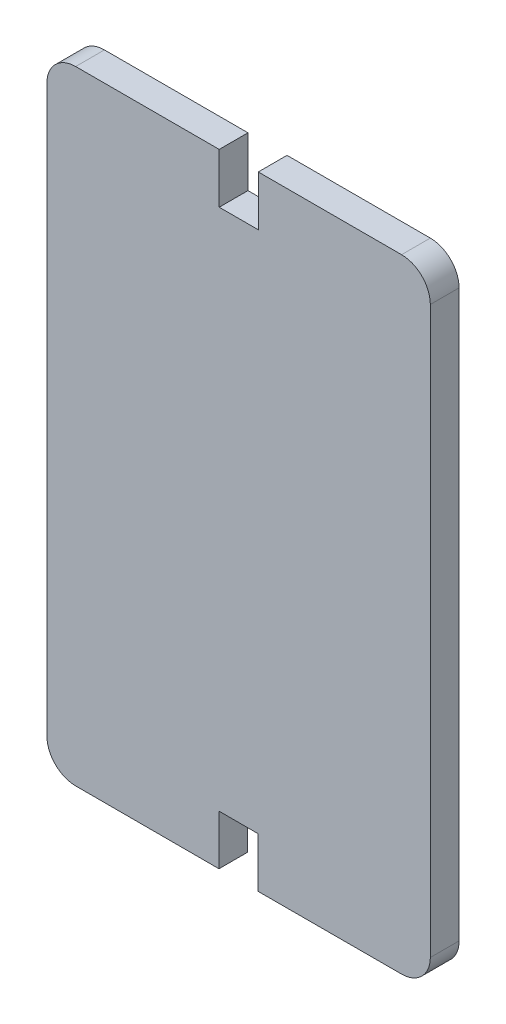
ISO-10303-21;
HEADER;
FILE_DESCRIPTION(('STEP AP214'),'2;1');
FILE_NAME('part.step','',(''),(''),'','','');
FILE_SCHEMA(('AUTOMOTIVE_DESIGN { 1 0 10303 214 1 1 1 1 }'));
ENDSEC;
DATA;
#1=APPLICATION_CONTEXT('core data for automotive mechanical design processes');
#2=APPLICATION_PROTOCOL_DEFINITION('international standard','automotive_design',2000,#1);
#3=PRODUCT_CONTEXT('',#1,'mechanical');
#4=PRODUCT('Part','Part','',(#3));
#5=PRODUCT_RELATED_PRODUCT_CATEGORY('part','',(#4));
#6=PRODUCT_DEFINITION_FORMATION('','',#4);
#7=PRODUCT_DEFINITION_CONTEXT('part definition',#1,'design');
#8=PRODUCT_DEFINITION('design','',#6,#7);
#9=PRODUCT_DEFINITION_SHAPE('','',#8);
#10=(LENGTH_UNIT() NAMED_UNIT(*) SI_UNIT(.MILLI.,.METRE.));
#11=(NAMED_UNIT(*) PLANE_ANGLE_UNIT() SI_UNIT($,.RADIAN.));
#12=(NAMED_UNIT(*) SI_UNIT($,.STERADIAN.) SOLID_ANGLE_UNIT());
#13=UNCERTAINTY_MEASURE_WITH_UNIT(LENGTH_MEASURE(1.E-05),#10,'distance_accuracy_value','');
#14=(GEOMETRIC_REPRESENTATION_CONTEXT(3) GLOBAL_UNCERTAINTY_ASSIGNED_CONTEXT((#13)) GLOBAL_UNIT_ASSIGNED_CONTEXT((#10,
#11,#12)) REPRESENTATION_CONTEXT('',''));
#15=CARTESIAN_POINT('',(0.,0.,0.));
#16=DIRECTION('',(0.,0.,1.));
#17=DIRECTION('',(1.,0.,0.));
#18=AXIS2_PLACEMENT_3D('',#15,#16,#17);
#19=CARTESIAN_POINT('',(0.,62.,3.));
#20=DIRECTION('',(1.,0.,0.));
#21=DIRECTION('',(0.,1.,0.));
#22=AXIS2_PLACEMENT_3D('',#19,#20,#21);
#23=PLANE('',#22);
#24=DIRECTION('',(0.,-1.,0.));
#25=VECTOR('',#24,1.);
#26=CARTESIAN_POINT('',(0.,62.,0.));
#27=LINE('',#26,#25);
#28=CARTESIAN_POINT('',(0.,62.,0.));
#29=VERTEX_POINT('',#28);
#30=CARTESIAN_POINT('',(0.,3.,0.));
#31=VERTEX_POINT('',#30);
#32=EDGE_CURVE('E177',#29,#31,#27,.T.);
#33=ORIENTED_EDGE('',*,*,#32,.T.);
#34=DIRECTION('',(0.,0.,-1.));
#35=VECTOR('',#34,1.);
#36=CARTESIAN_POINT('',(0.,3.,3.));
#37=LINE('',#36,#35);
#38=CARTESIAN_POINT('',(0.,3.,3.));
#39=VERTEX_POINT('',#38);
#40=EDGE_CURVE('E11',#39,#31,#37,.T.);
#41=ORIENTED_EDGE('',*,*,#40,.F.);
#42=DIRECTION('',(0.,-1.,0.));
#43=VECTOR('',#42,1.);
#44=CARTESIAN_POINT('',(0.,62.,3.));
#45=LINE('',#44,#43);
#46=CARTESIAN_POINT('',(0.,62.,3.));
#47=VERTEX_POINT('',#46);
#48=EDGE_CURVE('E207',#47,#39,#45,.T.);
#49=ORIENTED_EDGE('',*,*,#48,.F.);
#50=DIRECTION('',(0.,0.,-1.));
#51=VECTOR('',#50,1.);
#52=CARTESIAN_POINT('',(0.,62.,3.));
#53=LINE('',#52,#51);
#54=EDGE_CURVE('E173',#47,#29,#53,.T.);
#55=ORIENTED_EDGE('',*,*,#54,.T.);
#56=EDGE_LOOP('',(#33,#41,#49,#55));
#57=FACE_BOUND('',#56,.T.);
#58=ADVANCED_FACE('F33',(#57),#23,.F.);
#59=CARTESIAN_POINT('',(3.,3.,3.));
#60=DIRECTION('',(0.,0.,-1.));
#61=DIRECTION('',(-1.,0.,0.));
#62=AXIS2_PLACEMENT_3D('',#59,#60,#61);
#63=CYLINDRICAL_SURFACE('',#62,3.);
#64=CARTESIAN_POINT('',(3.,3.,0.));
#65=DIRECTION('',(0.,0.,1.));
#66=DIRECTION('',(1.,0.,0.));
#67=AXIS2_PLACEMENT_3D('',#64,#65,#66);
#68=CIRCLE('',#67,3.);
#69=CARTESIAN_POINT('',(3.,0.,0.));
#70=VERTEX_POINT('',#69);
#71=EDGE_CURVE('E180',#31,#70,#68,.T.);
#72=ORIENTED_EDGE('',*,*,#71,.T.);
#73=DIRECTION('',(0.,0.,-1.));
#74=VECTOR('',#73,1.);
#75=CARTESIAN_POINT('',(3.,0.,3.));
#76=LINE('',#75,#74);
#77=CARTESIAN_POINT('',(3.,0.,3.));
#78=VERTEX_POINT('',#77);
#79=EDGE_CURVE('E41',#78,#70,#76,.T.);
#80=ORIENTED_EDGE('',*,*,#79,.F.);
#81=CARTESIAN_POINT('',(3.,3.,3.));
#82=DIRECTION('',(0.,0.,1.));
#83=DIRECTION('',(1.,0.,0.));
#84=AXIS2_PLACEMENT_3D('',#81,#82,#83);
#85=CIRCLE('',#84,3.);
#86=EDGE_CURVE('E116',#39,#78,#85,.T.);
#87=ORIENTED_EDGE('',*,*,#86,.F.);
#88=ORIENTED_EDGE('',*,*,#40,.T.);
#89=EDGE_LOOP('',(#72,#80,#87,#88));
#90=FACE_BOUND('',#89,.T.);
#91=ADVANCED_FACE('F305',(#90),#63,.T.);
#92=CARTESIAN_POINT('',(3.,0.,3.));
#93=DIRECTION('',(0.000668896171430121,0.999999776288931,0.));
#94=DIRECTION('',(-0.999999776288931,0.000668896171430121,0.));
#95=AXIS2_PLACEMENT_3D('',#92,#93,#94);
#96=PLANE('',#95);
#97=DIRECTION('',(0.999999776288931,-0.000668896171430121,0.));
#98=VECTOR('',#97,1.);
#99=CARTESIAN_POINT('',(3.,0.,0.));
#100=LINE('',#99,#98);
#101=CARTESIAN_POINT('',(17.95,-0.009999999999991,0.));
#102=VERTEX_POINT('',#101);
#103=EDGE_CURVE('E182',#70,#102,#100,.T.);
#104=ORIENTED_EDGE('',*,*,#103,.T.);
#105=DIRECTION('',(0.,0.,-1.));
#106=VECTOR('',#105,1.);
#107=CARTESIAN_POINT('',(17.95,-0.009999999999991,3.));
#108=LINE('',#107,#106);
#109=CARTESIAN_POINT('',(17.95,-0.009999999999991,3.));
#110=VERTEX_POINT('',#109);
#111=EDGE_CURVE('E238',#110,#102,#108,.T.);
#112=ORIENTED_EDGE('',*,*,#111,.F.);
#113=DIRECTION('',(0.999999776288931,-0.000668896171430121,0.));
#114=VECTOR('',#113,1.);
#115=CARTESIAN_POINT('',(3.,0.,3.));
#116=LINE('',#115,#114);
#117=EDGE_CURVE('E246',#78,#110,#116,.T.);
#118=ORIENTED_EDGE('',*,*,#117,.F.);
#119=ORIENTED_EDGE('',*,*,#79,.T.);
#120=EDGE_LOOP('',(#104,#112,#118,#119));
#121=FACE_BOUND('',#120,.T.);
#122=ADVANCED_FACE('F244',(#121),#96,.F.);
#123=CARTESIAN_POINT('',(17.95,-0.009999999999991,3.));
#124=DIRECTION('',(-1.,0.,0.));
#125=DIRECTION('',(0.,0.,1.));
#126=AXIS2_PLACEMENT_3D('',#123,#124,#125);
#127=PLANE('',#126);
#128=DIRECTION('',(0.,1.,0.));
#129=VECTOR('',#128,1.);
#130=CARTESIAN_POINT('',(17.95,-0.009999999999991,0.));
#131=LINE('',#130,#129);
#132=CARTESIAN_POINT('',(17.95,5.2,0.));
#133=VERTEX_POINT('',#132);
#134=EDGE_CURVE('E184',#102,#133,#131,.T.);
#135=ORIENTED_EDGE('',*,*,#134,.T.);
#136=DIRECTION('',(0.,0.,-1.));
#137=VECTOR('',#136,1.);
#138=CARTESIAN_POINT('',(17.95,5.2,3.));
#139=LINE('',#138,#137);
#140=CARTESIAN_POINT('',(17.95,5.2,3.));
#141=VERTEX_POINT('',#140);
#142=EDGE_CURVE('E235',#141,#133,#139,.T.);
#143=ORIENTED_EDGE('',*,*,#142,.F.);
#144=DIRECTION('',(0.,1.,0.));
#145=VECTOR('',#144,1.);
#146=CARTESIAN_POINT('',(17.95,-0.009999999999991,3.));
#147=LINE('',#146,#145);
#148=EDGE_CURVE('E264',#110,#141,#147,.T.);
#149=ORIENTED_EDGE('',*,*,#148,.F.);
#150=ORIENTED_EDGE('',*,*,#111,.T.);
#151=EDGE_LOOP('',(#135,#143,#149,#150));
#152=FACE_BOUND('',#151,.T.);
#153=ADVANCED_FACE('F255',(#152),#127,.F.);
#154=CARTESIAN_POINT('',(17.95,5.2,3.));
#155=DIRECTION('',(0.,1.,0.));
#156=DIRECTION('',(0.,0.,1.));
#157=AXIS2_PLACEMENT_3D('',#154,#155,#156);
#158=PLANE('',#157);
#159=DIRECTION('',(1.,0.,0.));
#160=VECTOR('',#159,1.);
#161=CARTESIAN_POINT('',(17.95,5.2,0.));
#162=LINE('',#161,#160);
#163=CARTESIAN_POINT('',(22.025,5.2,0.));
#164=VERTEX_POINT('',#163);
#165=EDGE_CURVE('E186',#133,#164,#162,.T.);
#166=ORIENTED_EDGE('',*,*,#165,.T.);
#167=DIRECTION('',(0.,0.,-1.));
#168=VECTOR('',#167,1.);
#169=CARTESIAN_POINT('',(22.025,5.2,3.));
#170=LINE('',#169,#168);
#171=CARTESIAN_POINT('',(22.025,5.2,3.));
#172=VERTEX_POINT('',#171);
#173=EDGE_CURVE('E232',#172,#164,#170,.T.);
#174=ORIENTED_EDGE('',*,*,#173,.F.);
#175=DIRECTION('',(1.,0.,0.));
#176=VECTOR('',#175,1.);
#177=CARTESIAN_POINT('',(17.95,5.2,3.));
#178=LINE('',#177,#176);
#179=EDGE_CURVE('E261',#141,#172,#178,.T.);
#180=ORIENTED_EDGE('',*,*,#179,.F.);
#181=ORIENTED_EDGE('',*,*,#142,.T.);
#182=EDGE_LOOP('',(#166,#174,#180,#181));
#183=FACE_BOUND('',#182,.T.);
#184=ADVANCED_FACE('F259',(#183),#158,.F.);
#185=CARTESIAN_POINT('',(22.025,5.2,3.));
#186=DIRECTION('',(1.,0.,0.));
#187=DIRECTION('',(0.,0.,-1.));
#188=AXIS2_PLACEMENT_3D('',#185,#186,#187);
#189=PLANE('',#188);
#190=DIRECTION('',(0.,-1.,0.));
#191=VECTOR('',#190,1.);
#192=CARTESIAN_POINT('',(22.025,5.2,0.));
#193=LINE('',#192,#191);
#194=CARTESIAN_POINT('',(22.025,-0.009999999999991,0.));
#195=VERTEX_POINT('',#194);
#196=EDGE_CURVE('E188',#164,#195,#193,.T.);
#197=ORIENTED_EDGE('',*,*,#196,.T.);
#198=DIRECTION('',(0.,0.,-1.));
#199=VECTOR('',#198,1.);
#200=CARTESIAN_POINT('',(22.025,-0.009999999999991,3.));
#201=LINE('',#200,#199);
#202=CARTESIAN_POINT('',(22.025,-0.009999999999991,3.));
#203=VERTEX_POINT('',#202);
#204=EDGE_CURVE('E229',#203,#195,#201,.T.);
#205=ORIENTED_EDGE('',*,*,#204,.F.);
#206=DIRECTION('',(0.,-1.,0.));
#207=VECTOR('',#206,1.);
#208=CARTESIAN_POINT('',(22.025,5.2,3.));
#209=LINE('',#208,#207);
#210=EDGE_CURVE('E263',#172,#203,#209,.T.);
#211=ORIENTED_EDGE('',*,*,#210,.F.);
#212=ORIENTED_EDGE('',*,*,#173,.T.);
#213=EDGE_LOOP('',(#197,#205,#211,#212));
#214=FACE_BOUND('',#213,.T.);
#215=ADVANCED_FACE('F318',(#214),#189,.F.);
#216=CARTESIAN_POINT('',(22.025,-0.009999999999991,3.));
#217=DIRECTION('',(-0.000667779483829286,0.999999777035256,0.));
#218=DIRECTION('',(-0.999999777035256,-0.000667779483829286,0.));
#219=AXIS2_PLACEMENT_3D('',#216,#217,#218);
#220=PLANE('',#219);
#221=DIRECTION('',(0.999999777035256,0.000667779483829286,0.));
#222=VECTOR('',#221,1.);
#223=CARTESIAN_POINT('',(22.025,-0.009999999999991,0.));
#224=LINE('',#223,#222);
#225=CARTESIAN_POINT('',(37.,0.,0.));
#226=VERTEX_POINT('',#225);
#227=EDGE_CURVE('E190',#195,#226,#224,.T.);
#228=ORIENTED_EDGE('',*,*,#227,.T.);
#229=DIRECTION('',(0.,0.,-1.));
#230=VECTOR('',#229,1.);
#231=CARTESIAN_POINT('',(37.,0.,3.));
#232=LINE('',#231,#230);
#233=CARTESIAN_POINT('',(37.,0.,3.));
#234=VERTEX_POINT('',#233);
#235=EDGE_CURVE('E226',#234,#226,#232,.T.);
#236=ORIENTED_EDGE('',*,*,#235,.F.);
#237=DIRECTION('',(0.999999777035256,0.000667779483829286,0.));
#238=VECTOR('',#237,1.);
#239=CARTESIAN_POINT('',(22.025,-0.009999999999991,3.));
#240=LINE('',#239,#238);
#241=EDGE_CURVE('E266',#203,#234,#240,.T.);
#242=ORIENTED_EDGE('',*,*,#241,.F.);
#243=ORIENTED_EDGE('',*,*,#204,.T.);
#244=EDGE_LOOP('',(#228,#236,#242,#243));
#245=FACE_BOUND('',#244,.T.);
#246=ADVANCED_FACE('F321',(#245),#220,.F.);
#247=CARTESIAN_POINT('',(37.,3.,3.));
#248=DIRECTION('',(0.,0.,-1.));
#249=DIRECTION('',(-1.,0.,0.));
#250=AXIS2_PLACEMENT_3D('',#247,#248,#249);
#251=CYLINDRICAL_SURFACE('',#250,3.);
#252=CARTESIAN_POINT('',(37.,3.,0.));
#253=DIRECTION('',(0.,0.,1.));
#254=DIRECTION('',(1.,0.,0.));
#255=AXIS2_PLACEMENT_3D('',#252,#253,#254);
#256=CIRCLE('',#255,3.);
#257=CARTESIAN_POINT('',(40.,3.,0.));
#258=VERTEX_POINT('',#257);
#259=EDGE_CURVE('E192',#226,#258,#256,.T.);
#260=ORIENTED_EDGE('',*,*,#259,.T.);
#261=DIRECTION('',(0.,0.,-1.));
#262=VECTOR('',#261,1.);
#263=CARTESIAN_POINT('',(40.,3.,3.));
#264=LINE('',#263,#262);
#265=CARTESIAN_POINT('',(40.,3.,3.));
#266=VERTEX_POINT('',#265);
#267=EDGE_CURVE('E223',#266,#258,#264,.T.);
#268=ORIENTED_EDGE('',*,*,#267,.F.);
#269=CARTESIAN_POINT('',(37.,3.,3.));
#270=DIRECTION('',(0.,0.,1.));
#271=DIRECTION('',(1.,0.,0.));
#272=AXIS2_PLACEMENT_3D('',#269,#270,#271);
#273=CIRCLE('',#272,3.);
#274=EDGE_CURVE('E272',#234,#266,#273,.T.);
#275=ORIENTED_EDGE('',*,*,#274,.F.);
#276=ORIENTED_EDGE('',*,*,#235,.T.);
#277=EDGE_LOOP('',(#260,#268,#275,#276));
#278=FACE_BOUND('',#277,.T.);
#279=ADVANCED_FACE('F325',(#278),#251,.T.);
#280=CARTESIAN_POINT('',(40.,3.,3.));
#281=DIRECTION('',(-1.,0.,0.));
#282=DIRECTION('',(0.,0.,1.));
#283=AXIS2_PLACEMENT_3D('',#280,#281,#282);
#284=PLANE('',#283);
#285=DIRECTION('',(0.,1.,0.));
#286=VECTOR('',#285,1.);
#287=CARTESIAN_POINT('',(40.,3.,0.));
#288=LINE('',#287,#286);
#289=CARTESIAN_POINT('',(40.,62.,0.));
#290=VERTEX_POINT('',#289);
#291=EDGE_CURVE('E194',#258,#290,#288,.T.);
#292=ORIENTED_EDGE('',*,*,#291,.T.);
#293=DIRECTION('',(0.,0.,-1.));
#294=VECTOR('',#293,1.);
#295=CARTESIAN_POINT('',(40.,62.,3.));
#296=LINE('',#295,#294);
#297=CARTESIAN_POINT('',(40.,62.,3.));
#298=VERTEX_POINT('',#297);
#299=EDGE_CURVE('E220',#298,#290,#296,.T.);
#300=ORIENTED_EDGE('',*,*,#299,.F.);
#301=DIRECTION('',(0.,1.,0.));
#302=VECTOR('',#301,1.);
#303=CARTESIAN_POINT('',(40.,3.,3.));
#304=LINE('',#303,#302);
#305=EDGE_CURVE('E274',#266,#298,#304,.T.);
#306=ORIENTED_EDGE('',*,*,#305,.F.);
#307=ORIENTED_EDGE('',*,*,#267,.T.);
#308=EDGE_LOOP('',(#292,#300,#306,#307));
#309=FACE_BOUND('',#308,.T.);
#310=ADVANCED_FACE('F329',(#309),#284,.F.);
#311=CARTESIAN_POINT('',(37.,62.,3.));
#312=DIRECTION('',(0.,0.,-1.));
#313=DIRECTION('',(-1.,0.,0.));
#314=AXIS2_PLACEMENT_3D('',#311,#312,#313);
#315=CYLINDRICAL_SURFACE('',#314,3.);
#316=CARTESIAN_POINT('',(37.,62.,0.));
#317=DIRECTION('',(0.,0.,1.));
#318=DIRECTION('',(1.,0.,0.));
#319=AXIS2_PLACEMENT_3D('',#316,#317,#318);
#320=CIRCLE('',#319,3.);
#321=CARTESIAN_POINT('',(37.,65.,0.));
#322=VERTEX_POINT('',#321);
#323=EDGE_CURVE('E196',#290,#322,#320,.T.);
#324=ORIENTED_EDGE('',*,*,#323,.T.);
#325=DIRECTION('',(0.,0.,-1.));
#326=VECTOR('',#325,1.);
#327=CARTESIAN_POINT('',(37.,65.,3.));
#328=LINE('',#327,#326);
#329=CARTESIAN_POINT('',(37.,65.,3.));
#330=VERTEX_POINT('',#329);
#331=EDGE_CURVE('E217',#330,#322,#328,.T.);
#332=ORIENTED_EDGE('',*,*,#331,.F.);
#333=CARTESIAN_POINT('',(37.,62.,3.));
#334=DIRECTION('',(0.,0.,1.));
#335=DIRECTION('',(1.,0.,0.));
#336=AXIS2_PLACEMENT_3D('',#333,#334,#335);
#337=CIRCLE('',#336,3.);
#338=EDGE_CURVE('E276',#298,#330,#337,.T.);
#339=ORIENTED_EDGE('',*,*,#338,.F.);
#340=ORIENTED_EDGE('',*,*,#299,.T.);
#341=EDGE_LOOP('',(#324,#332,#339,#340));
#342=FACE_BOUND('',#341,.T.);
#343=ADVANCED_FACE('F333',(#342),#315,.T.);
#344=CARTESIAN_POINT('',(37.,65.,3.));
#345=DIRECTION('',(0.,-1.,0.));
#346=DIRECTION('',(0.,0.,-1.));
#347=AXIS2_PLACEMENT_3D('',#344,#345,#346);
#348=PLANE('',#347);
#349=DIRECTION('',(-1.,0.,0.));
#350=VECTOR('',#349,1.);
#351=CARTESIAN_POINT('',(37.,65.,0.));
#352=LINE('',#351,#350);
#353=CARTESIAN_POINT('',(22.05,65.,0.));
#354=VERTEX_POINT('',#353);
#355=EDGE_CURVE('E198',#322,#354,#352,.T.);
#356=ORIENTED_EDGE('',*,*,#355,.T.);
#357=DIRECTION('',(0.,0.,-1.));
#358=VECTOR('',#357,1.);
#359=CARTESIAN_POINT('',(22.05,65.,3.));
#360=LINE('',#359,#358);
#361=CARTESIAN_POINT('',(22.05,65.,3.));
#362=VERTEX_POINT('',#361);
#363=EDGE_CURVE('E214',#362,#354,#360,.T.);
#364=ORIENTED_EDGE('',*,*,#363,.F.);
#365=DIRECTION('',(-1.,0.,0.));
#366=VECTOR('',#365,1.);
#367=CARTESIAN_POINT('',(37.,65.,3.));
#368=LINE('',#367,#366);
#369=EDGE_CURVE('E278',#330,#362,#368,.T.);
#370=ORIENTED_EDGE('',*,*,#369,.F.);
#371=ORIENTED_EDGE('',*,*,#331,.T.);
#372=EDGE_LOOP('',(#356,#364,#370,#371));
#373=FACE_BOUND('',#372,.T.);
#374=ADVANCED_FACE('F337',(#373),#348,.F.);
#375=CARTESIAN_POINT('',(22.05,65.,3.));
#376=DIRECTION('',(1.,0.,0.));
#377=DIRECTION('',(0.,0.,-1.));
#378=AXIS2_PLACEMENT_3D('',#375,#376,#377);
#379=PLANE('',#378);
#380=DIRECTION('',(0.,-1.,0.));
#381=VECTOR('',#380,1.);
#382=CARTESIAN_POINT('',(22.05,65.,0.));
#383=LINE('',#382,#381);
#384=CARTESIAN_POINT('',(22.05,59.775,0.));
#385=VERTEX_POINT('',#384);
#386=EDGE_CURVE('E200',#354,#385,#383,.T.);
#387=ORIENTED_EDGE('',*,*,#386,.T.);
#388=DIRECTION('',(0.,0.,-1.));
#389=VECTOR('',#388,1.);
#390=CARTESIAN_POINT('',(22.05,59.775,3.));
#391=LINE('',#390,#389);
#392=CARTESIAN_POINT('',(22.05,59.775,3.));
#393=VERTEX_POINT('',#392);
#394=EDGE_CURVE('E211',#393,#385,#391,.T.);
#395=ORIENTED_EDGE('',*,*,#394,.F.);
#396=DIRECTION('',(0.,-1.,0.));
#397=VECTOR('',#396,1.);
#398=CARTESIAN_POINT('',(22.05,65.,3.));
#399=LINE('',#398,#397);
#400=EDGE_CURVE('E280',#362,#393,#399,.T.);
#401=ORIENTED_EDGE('',*,*,#400,.F.);
#402=ORIENTED_EDGE('',*,*,#363,.T.);
#403=EDGE_LOOP('',(#387,#395,#401,#402));
#404=FACE_BOUND('',#403,.T.);
#405=ADVANCED_FACE('F286',(#404),#379,.F.);
#406=CARTESIAN_POINT('',(22.05,59.775,3.));
#407=DIRECTION('',(0.,-1.,0.));
#408=DIRECTION('',(0.,0.,-1.));
#409=AXIS2_PLACEMENT_3D('',#406,#407,#408);
#410=PLANE('',#409);
#411=DIRECTION('',(-1.,0.,0.));
#412=VECTOR('',#411,1.);
#413=CARTESIAN_POINT('',(22.05,59.775,0.));
#414=LINE('',#413,#412);
#415=CARTESIAN_POINT('',(17.975,59.775,0.));
#416=VERTEX_POINT('',#415);
#417=EDGE_CURVE('E202',#385,#416,#414,.T.);
#418=ORIENTED_EDGE('',*,*,#417,.T.);
#419=DIRECTION('',(0.,0.,-1.));
#420=VECTOR('',#419,1.);
#421=CARTESIAN_POINT('',(17.975,59.775,3.));
#422=LINE('',#421,#420);
#423=CARTESIAN_POINT('',(17.975,59.775,3.));
#424=VERTEX_POINT('',#423);
#425=EDGE_CURVE('E168',#424,#416,#422,.T.);
#426=ORIENTED_EDGE('',*,*,#425,.F.);
#427=DIRECTION('',(-1.,0.,0.));
#428=VECTOR('',#427,1.);
#429=CARTESIAN_POINT('',(22.05,59.775,3.));
#430=LINE('',#429,#428);
#431=EDGE_CURVE('E159',#393,#424,#430,.T.);
#432=ORIENTED_EDGE('',*,*,#431,.F.);
#433=ORIENTED_EDGE('',*,*,#394,.T.);
#434=EDGE_LOOP('',(#418,#426,#432,#433));
#435=FACE_BOUND('',#434,.T.);
#436=ADVANCED_FACE('F290',(#435),#410,.F.);
#437=CARTESIAN_POINT('',(17.975,59.775,3.));
#438=DIRECTION('',(-1.,0.,0.));
#439=DIRECTION('',(0.,0.,1.));
#440=AXIS2_PLACEMENT_3D('',#437,#438,#439);
#441=PLANE('',#440);
#442=DIRECTION('',(0.,1.,0.));
#443=VECTOR('',#442,1.);
#444=CARTESIAN_POINT('',(17.975,59.775,0.));
#445=LINE('',#444,#443);
#446=CARTESIAN_POINT('',(17.975,65.,0.));
#447=VERTEX_POINT('',#446);
#448=EDGE_CURVE('E167',#416,#447,#445,.T.);
#449=ORIENTED_EDGE('',*,*,#448,.T.);
#450=DIRECTION('',(0.,0.,-1.));
#451=VECTOR('',#450,1.);
#452=CARTESIAN_POINT('',(17.975,65.,3.));
#453=LINE('',#452,#451);
#454=CARTESIAN_POINT('',(17.975,65.,3.));
#455=VERTEX_POINT('',#454);
#456=EDGE_CURVE('E164',#455,#447,#453,.T.);
#457=ORIENTED_EDGE('',*,*,#456,.F.);
#458=DIRECTION('',(0.,1.,0.));
#459=VECTOR('',#458,1.);
#460=CARTESIAN_POINT('',(17.975,59.775,3.));
#461=LINE('',#460,#459);
#462=EDGE_CURVE('E153',#424,#455,#461,.T.);
#463=ORIENTED_EDGE('',*,*,#462,.F.);
#464=ORIENTED_EDGE('',*,*,#425,.T.);
#465=EDGE_LOOP('',(#449,#457,#463,#464));
#466=FACE_BOUND('',#465,.T.);
#467=ADVANCED_FACE('F165',(#466),#441,.F.);
#468=CARTESIAN_POINT('',(17.975,65.,3.));
#469=DIRECTION('',(0.,-1.,0.));
#470=DIRECTION('',(0.,0.,-1.));
#471=AXIS2_PLACEMENT_3D('',#468,#469,#470);
#472=PLANE('',#471);
#473=DIRECTION('',(-1.,0.,0.));
#474=VECTOR('',#473,1.);
#475=CARTESIAN_POINT('',(17.975,65.,0.));
#476=LINE('',#475,#474);
#477=CARTESIAN_POINT('',(3.,65.,0.));
#478=VERTEX_POINT('',#477);
#479=EDGE_CURVE('E102',#447,#478,#476,.T.);
#480=ORIENTED_EDGE('',*,*,#479,.T.);
#481=DIRECTION('',(0.,0.,-1.));
#482=VECTOR('',#481,1.);
#483=CARTESIAN_POINT('',(3.,65.,3.));
#484=LINE('',#483,#482);
#485=CARTESIAN_POINT('',(3.,65.,3.));
#486=VERTEX_POINT('',#485);
#487=EDGE_CURVE('E169',#486,#478,#484,.T.);
#488=ORIENTED_EDGE('',*,*,#487,.F.);
#489=DIRECTION('',(-1.,0.,0.));
#490=VECTOR('',#489,1.);
#491=CARTESIAN_POINT('',(17.975,65.,3.));
#492=LINE('',#491,#490);
#493=EDGE_CURVE('E157',#455,#486,#492,.T.);
#494=ORIENTED_EDGE('',*,*,#493,.F.);
#495=ORIENTED_EDGE('',*,*,#456,.T.);
#496=EDGE_LOOP('',(#480,#488,#494,#495));
#497=FACE_BOUND('',#496,.T.);
#498=ADVANCED_FACE('F171',(#497),#472,.F.);
#499=CARTESIAN_POINT('',(3.,62.,3.));
#500=DIRECTION('',(0.,0.,-1.));
#501=DIRECTION('',(-1.,0.,0.));
#502=AXIS2_PLACEMENT_3D('',#499,#500,#501);
#503=CYLINDRICAL_SURFACE('',#502,3.);
#504=CARTESIAN_POINT('',(3.,62.,0.));
#505=DIRECTION('',(0.,0.,1.));
#506=DIRECTION('',(1.,0.,0.));
#507=AXIS2_PLACEMENT_3D('',#504,#505,#506);
#508=CIRCLE('',#507,3.);
#509=EDGE_CURVE('E108',#478,#29,#508,.T.);
#510=ORIENTED_EDGE('',*,*,#509,.T.);
#511=ORIENTED_EDGE('',*,*,#54,.F.);
#512=CARTESIAN_POINT('',(3.,62.,3.));
#513=DIRECTION('',(0.,0.,1.));
#514=DIRECTION('',(1.,0.,0.));
#515=AXIS2_PLACEMENT_3D('',#512,#513,#514);
#516=CIRCLE('',#515,3.);
#517=EDGE_CURVE('E49',#486,#47,#516,.T.);
#518=ORIENTED_EDGE('',*,*,#517,.F.);
#519=ORIENTED_EDGE('',*,*,#487,.T.);
#520=EDGE_LOOP('',(#510,#511,#518,#519));
#521=FACE_BOUND('',#520,.T.);
#522=ADVANCED_FACE('F294',(#521),#503,.T.);
#523=CARTESIAN_POINT('',(3.,3.,3.));
#524=DIRECTION('',(0.,0.,1.));
#525=DIRECTION('',(1.,0.,0.));
#526=AXIS2_PLACEMENT_3D('',#523,#524,#525);
#527=PLANE('',#526);
#528=ORIENTED_EDGE('',*,*,#48,.T.);
#529=ORIENTED_EDGE('',*,*,#86,.T.);
#530=ORIENTED_EDGE('',*,*,#117,.T.);
#531=ORIENTED_EDGE('',*,*,#148,.T.);
#532=ORIENTED_EDGE('',*,*,#179,.T.);
#533=ORIENTED_EDGE('',*,*,#210,.T.);
#534=ORIENTED_EDGE('',*,*,#241,.T.);
#535=ORIENTED_EDGE('',*,*,#274,.T.);
#536=ORIENTED_EDGE('',*,*,#305,.T.);
#537=ORIENTED_EDGE('',*,*,#338,.T.);
#538=ORIENTED_EDGE('',*,*,#369,.T.);
#539=ORIENTED_EDGE('',*,*,#400,.T.);
#540=ORIENTED_EDGE('',*,*,#431,.T.);
#541=ORIENTED_EDGE('',*,*,#462,.T.);
#542=ORIENTED_EDGE('',*,*,#493,.T.);
#543=ORIENTED_EDGE('',*,*,#517,.T.);
#544=EDGE_LOOP('',(#528,#529,#530,#531,#532,#533,#534,#535,#536,#537,#538,#539,#540,#541,#542,#543));
#545=FACE_BOUND('',#544,.T.);
#546=ADVANCED_FACE('F155',(#545),#527,.T.);
#547=CARTESIAN_POINT('',(3.,3.,0.));
#548=DIRECTION('',(0.,0.,1.));
#549=DIRECTION('',(1.,0.,0.));
#550=AXIS2_PLACEMENT_3D('',#547,#548,#549);
#551=PLANE('',#550);
#552=ORIENTED_EDGE('',*,*,#32,.F.);
#553=ORIENTED_EDGE('',*,*,#509,.F.);
#554=ORIENTED_EDGE('',*,*,#479,.F.);
#555=ORIENTED_EDGE('',*,*,#448,.F.);
#556=ORIENTED_EDGE('',*,*,#417,.F.);
#557=ORIENTED_EDGE('',*,*,#386,.F.);
#558=ORIENTED_EDGE('',*,*,#355,.F.);
#559=ORIENTED_EDGE('',*,*,#323,.F.);
#560=ORIENTED_EDGE('',*,*,#291,.F.);
#561=ORIENTED_EDGE('',*,*,#259,.F.);
#562=ORIENTED_EDGE('',*,*,#227,.F.);
#563=ORIENTED_EDGE('',*,*,#196,.F.);
#564=ORIENTED_EDGE('',*,*,#165,.F.);
#565=ORIENTED_EDGE('',*,*,#134,.F.);
#566=ORIENTED_EDGE('',*,*,#103,.F.);
#567=ORIENTED_EDGE('',*,*,#71,.F.);
#568=EDGE_LOOP('',(#552,#553,#554,#555,#556,#557,#558,#559,#560,#561,#562,#563,#564,#565,#566,#567));
#569=FACE_BOUND('',#568,.T.);
#570=ADVANCED_FACE('F250',(#569),#551,.F.);
#571=CLOSED_SHELL('',(#58,#91,#122,#153,#184,#215,#246,#279,#310,#343,#374,#405,#436,#467,#498,
#522,#546,#570));
#572=MANIFOLD_SOLID_BREP('B2',#571);
#573=ADVANCED_BREP_SHAPE_REPRESENTATION('',(#18,#572),#14);
#574=SHAPE_DEFINITION_REPRESENTATION(#9,#573);
ENDSEC;
END-ISO-10303-21;
